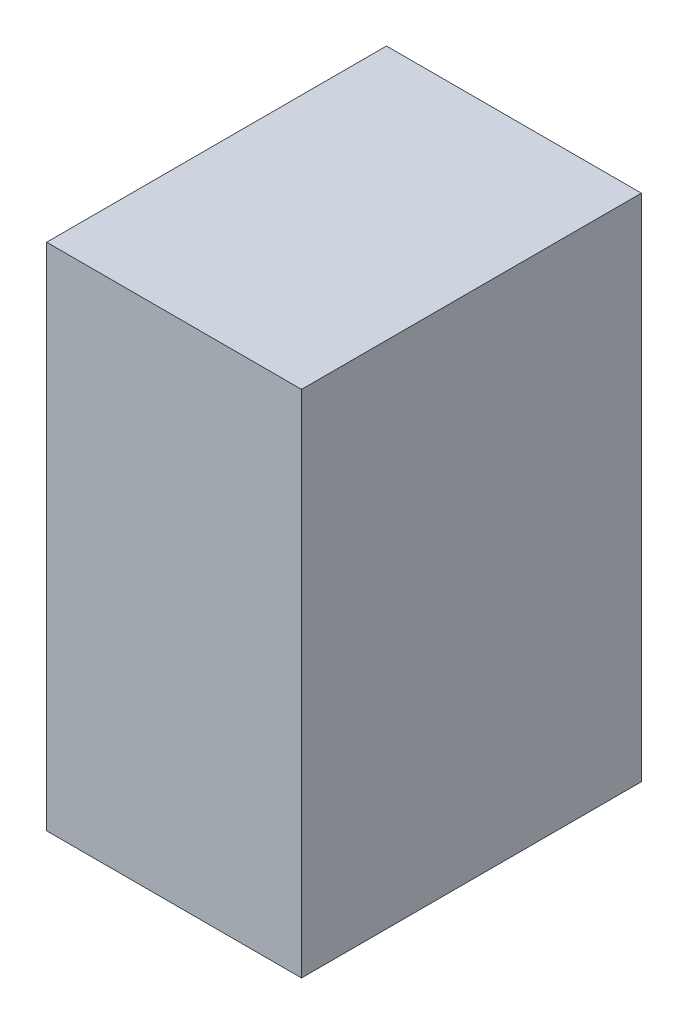
ISO-10303-21;
HEADER;
FILE_DESCRIPTION(('STEP AP214'),'2;1');
FILE_NAME('part.step','',(''),(''),'','','');
FILE_SCHEMA(('AUTOMOTIVE_DESIGN { 1 0 10303 214 1 1 1 1 }'));
ENDSEC;
DATA;
#1=APPLICATION_CONTEXT('core data for automotive mechanical design processes');
#2=APPLICATION_PROTOCOL_DEFINITION('international standard','automotive_design',2000,#1);
#3=PRODUCT_CONTEXT('',#1,'mechanical');
#4=PRODUCT('Part','Part','',(#3));
#5=PRODUCT_RELATED_PRODUCT_CATEGORY('part','',(#4));
#6=PRODUCT_DEFINITION_FORMATION('','',#4);
#7=PRODUCT_DEFINITION_CONTEXT('part definition',#1,'design');
#8=PRODUCT_DEFINITION('design','',#6,#7);
#9=PRODUCT_DEFINITION_SHAPE('','',#8);
#10=(LENGTH_UNIT() NAMED_UNIT(*) SI_UNIT(.MILLI.,.METRE.));
#11=(NAMED_UNIT(*) PLANE_ANGLE_UNIT() SI_UNIT($,.RADIAN.));
#12=(NAMED_UNIT(*) SI_UNIT($,.STERADIAN.) SOLID_ANGLE_UNIT());
#13=UNCERTAINTY_MEASURE_WITH_UNIT(LENGTH_MEASURE(1.E-05),#10,'distance_accuracy_value','');
#14=(GEOMETRIC_REPRESENTATION_CONTEXT(3) GLOBAL_UNCERTAINTY_ASSIGNED_CONTEXT((#13)) GLOBAL_UNIT_ASSIGNED_CONTEXT((#10,
#11,#12)) REPRESENTATION_CONTEXT('',''));
#15=CARTESIAN_POINT('',(0.,0.,0.));
#16=DIRECTION('',(0.,0.,1.));
#17=DIRECTION('',(1.,0.,0.));
#18=AXIS2_PLACEMENT_3D('',#15,#16,#17);
#19=CARTESIAN_POINT('',(-37.5,150.,-50.));
#20=DIRECTION('',(1.,0.,0.));
#21=DIRECTION('',(0.,0.,-1.));
#22=AXIS2_PLACEMENT_3D('',#19,#20,#21);
#23=PLANE('',#22);
#24=DIRECTION('',(0.,0.,1.));
#25=VECTOR('',#24,1.);
#26=CARTESIAN_POINT('',(-37.5,0.,-50.));
#27=LINE('',#26,#25);
#28=CARTESIAN_POINT('',(-37.5,0.,-50.));
#29=VERTEX_POINT('',#28);
#30=CARTESIAN_POINT('',(-37.5,0.,50.));
#31=VERTEX_POINT('',#30);
#32=EDGE_CURVE('E80',#29,#31,#27,.T.);
#33=ORIENTED_EDGE('',*,*,#32,.T.);
#34=DIRECTION('',(0.,-1.,0.));
#35=VECTOR('',#34,1.);
#36=CARTESIAN_POINT('',(-37.5,150.,50.));
#37=LINE('',#36,#35);
#38=CARTESIAN_POINT('',(-37.5,150.,50.));
#39=VERTEX_POINT('',#38);
#40=EDGE_CURVE('E11',#39,#31,#37,.T.);
#41=ORIENTED_EDGE('',*,*,#40,.F.);
#42=DIRECTION('',(0.,0.,1.));
#43=VECTOR('',#42,1.);
#44=CARTESIAN_POINT('',(-37.5,150.,-50.));
#45=LINE('',#44,#43);
#46=CARTESIAN_POINT('',(-37.5,150.,-50.));
#47=VERTEX_POINT('',#46);
#48=EDGE_CURVE('E98',#47,#39,#45,.T.);
#49=ORIENTED_EDGE('',*,*,#48,.F.);
#50=DIRECTION('',(0.,-1.,0.));
#51=VECTOR('',#50,1.);
#52=CARTESIAN_POINT('',(-37.5,150.,-50.));
#53=LINE('',#52,#51);
#54=EDGE_CURVE('E92',#47,#29,#53,.T.);
#55=ORIENTED_EDGE('',*,*,#54,.T.);
#56=EDGE_LOOP('',(#33,#41,#49,#55));
#57=FACE_BOUND('',#56,.T.);
#58=ADVANCED_FACE('F36',(#57),#23,.F.);
#59=CARTESIAN_POINT('',(-37.5,150.,50.));
#60=DIRECTION('',(0.,0.,-1.));
#61=DIRECTION('',(-1.,0.,0.));
#62=AXIS2_PLACEMENT_3D('',#59,#60,#61);
#63=PLANE('',#62);
#64=DIRECTION('',(1.,0.,0.));
#65=VECTOR('',#64,1.);
#66=CARTESIAN_POINT('',(-37.5,0.,50.));
#67=LINE('',#66,#65);
#68=CARTESIAN_POINT('',(37.5,0.,50.));
#69=VERTEX_POINT('',#68);
#70=EDGE_CURVE('E76',#31,#69,#67,.T.);
#71=ORIENTED_EDGE('',*,*,#70,.T.);
#72=DIRECTION('',(0.,-1.,0.));
#73=VECTOR('',#72,1.);
#74=CARTESIAN_POINT('',(37.5,150.,50.));
#75=LINE('',#74,#73);
#76=CARTESIAN_POINT('',(37.5,150.,50.));
#77=VERTEX_POINT('',#76);
#78=EDGE_CURVE('E43',#77,#69,#75,.T.);
#79=ORIENTED_EDGE('',*,*,#78,.F.);
#80=DIRECTION('',(1.,0.,0.));
#81=VECTOR('',#80,1.);
#82=CARTESIAN_POINT('',(-37.5,150.,50.));
#83=LINE('',#82,#81);
#84=EDGE_CURVE('E88',#39,#77,#83,.T.);
#85=ORIENTED_EDGE('',*,*,#84,.F.);
#86=ORIENTED_EDGE('',*,*,#40,.T.);
#87=EDGE_LOOP('',(#71,#79,#85,#86));
#88=FACE_BOUND('',#87,.T.);
#89=ADVANCED_FACE('F87',(#88),#63,.F.);
#90=CARTESIAN_POINT('',(37.5,150.,-50.));
#91=DIRECTION('',(-1.,0.,0.));
#92=DIRECTION('',(0.,0.,1.));
#93=AXIS2_PLACEMENT_3D('',#90,#91,#92);
#94=PLANE('',#93);
#95=DIRECTION('',(0.,0.,-1.));
#96=VECTOR('',#95,1.);
#97=CARTESIAN_POINT('',(37.5,0.,-50.));
#98=LINE('',#97,#96);
#99=CARTESIAN_POINT('',(37.5,0.,-50.));
#100=VERTEX_POINT('',#99);
#101=EDGE_CURVE('E81',#69,#100,#98,.T.);
#102=ORIENTED_EDGE('',*,*,#101,.T.);
#103=DIRECTION('',(0.,-1.,0.));
#104=VECTOR('',#103,1.);
#105=CARTESIAN_POINT('',(37.5,150.,-50.));
#106=LINE('',#105,#104);
#107=CARTESIAN_POINT('',(37.5,150.,-50.));
#108=VERTEX_POINT('',#107);
#109=EDGE_CURVE('E104',#108,#100,#106,.T.);
#110=ORIENTED_EDGE('',*,*,#109,.F.);
#111=DIRECTION('',(0.,0.,-1.));
#112=VECTOR('',#111,1.);
#113=CARTESIAN_POINT('',(37.5,150.,-50.));
#114=LINE('',#113,#112);
#115=EDGE_CURVE('E55',#77,#108,#114,.T.);
#116=ORIENTED_EDGE('',*,*,#115,.F.);
#117=ORIENTED_EDGE('',*,*,#78,.T.);
#118=EDGE_LOOP('',(#102,#110,#116,#117));
#119=FACE_BOUND('',#118,.T.);
#120=ADVANCED_FACE('F107',(#119),#94,.F.);
#121=CARTESIAN_POINT('',(-37.5,150.,-50.));
#122=DIRECTION('',(0.,0.,1.));
#123=DIRECTION('',(1.,0.,0.));
#124=AXIS2_PLACEMENT_3D('',#121,#122,#123);
#125=PLANE('',#124);
#126=DIRECTION('',(-1.,0.,0.));
#127=VECTOR('',#126,1.);
#128=CARTESIAN_POINT('',(-37.5,0.,-50.));
#129=LINE('',#128,#127);
#130=EDGE_CURVE('E96',#100,#29,#129,.T.);
#131=ORIENTED_EDGE('',*,*,#130,.T.);
#132=ORIENTED_EDGE('',*,*,#54,.F.);
#133=DIRECTION('',(-1.,0.,0.));
#134=VECTOR('',#133,1.);
#135=CARTESIAN_POINT('',(-37.5,150.,-50.));
#136=LINE('',#135,#134);
#137=EDGE_CURVE('E50',#108,#47,#136,.T.);
#138=ORIENTED_EDGE('',*,*,#137,.F.);
#139=ORIENTED_EDGE('',*,*,#109,.T.);
#140=EDGE_LOOP('',(#131,#132,#138,#139));
#141=FACE_BOUND('',#140,.T.);
#142=ADVANCED_FACE('F109',(#141),#125,.F.);
#143=CARTESIAN_POINT('',(-37.5,150.,50.));
#144=DIRECTION('',(0.,1.,0.));
#145=DIRECTION('',(0.,0.,1.));
#146=AXIS2_PLACEMENT_3D('',#143,#144,#145);
#147=PLANE('',#146);
#148=ORIENTED_EDGE('',*,*,#48,.T.);
#149=ORIENTED_EDGE('',*,*,#84,.T.);
#150=ORIENTED_EDGE('',*,*,#115,.T.);
#151=ORIENTED_EDGE('',*,*,#137,.T.);
#152=EDGE_LOOP('',(#148,#149,#150,#151));
#153=FACE_BOUND('',#152,.T.);
#154=ADVANCED_FACE('F110',(#153),#147,.T.);
#155=CARTESIAN_POINT('',(-37.5,0.,50.));
#156=DIRECTION('',(0.,1.,0.));
#157=DIRECTION('',(0.,0.,1.));
#158=AXIS2_PLACEMENT_3D('',#155,#156,#157);
#159=PLANE('',#158);
#160=ORIENTED_EDGE('',*,*,#32,.F.);
#161=ORIENTED_EDGE('',*,*,#130,.F.);
#162=ORIENTED_EDGE('',*,*,#101,.F.);
#163=ORIENTED_EDGE('',*,*,#70,.F.);
#164=EDGE_LOOP('',(#160,#161,#162,#163));
#165=FACE_BOUND('',#164,.T.);
#166=ADVANCED_FACE('F77',(#165),#159,.F.);
#167=CLOSED_SHELL('',(#58,#89,#120,#142,#154,#166));
#168=MANIFOLD_SOLID_BREP('B2',#167);
#169=ADVANCED_BREP_SHAPE_REPRESENTATION('',(#18,#168),#14);
#170=SHAPE_DEFINITION_REPRESENTATION(#9,#169);
ENDSEC;
END-ISO-10303-21;
